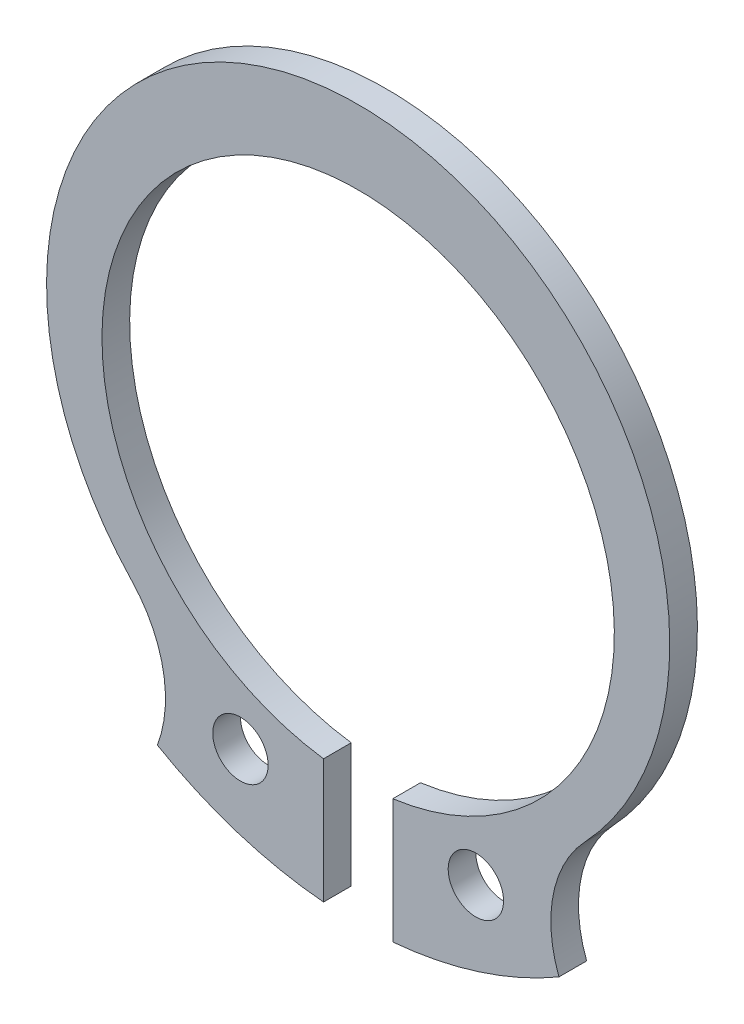
ISO-10303-21;
HEADER;
FILE_DESCRIPTION(('STEP AP214'),'2;1');
FILE_NAME('part.step','',(''),(''),'','','');
FILE_SCHEMA(('AUTOMOTIVE_DESIGN { 1 0 10303 214 1 1 1 1 }'));
ENDSEC;
DATA;
#1=APPLICATION_CONTEXT('core data for automotive mechanical design processes');
#2=APPLICATION_PROTOCOL_DEFINITION('international standard','automotive_design',2000,#1);
#3=PRODUCT_CONTEXT('',#1,'mechanical');
#4=PRODUCT('Part','Part','',(#3));
#5=PRODUCT_RELATED_PRODUCT_CATEGORY('part','',(#4));
#6=PRODUCT_DEFINITION_FORMATION('','',#4);
#7=PRODUCT_DEFINITION_CONTEXT('part definition',#1,'design');
#8=PRODUCT_DEFINITION('design','',#6,#7);
#9=PRODUCT_DEFINITION_SHAPE('','',#8);
#10=(LENGTH_UNIT() NAMED_UNIT(*) SI_UNIT(.MILLI.,.METRE.));
#11=(NAMED_UNIT(*) PLANE_ANGLE_UNIT() SI_UNIT($,.RADIAN.));
#12=(NAMED_UNIT(*) SI_UNIT($,.STERADIAN.) SOLID_ANGLE_UNIT());
#13=UNCERTAINTY_MEASURE_WITH_UNIT(LENGTH_MEASURE(1.E-05),#10,'distance_accuracy_value','');
#14=(GEOMETRIC_REPRESENTATION_CONTEXT(3) GLOBAL_UNCERTAINTY_ASSIGNED_CONTEXT((#13)) GLOBAL_UNIT_ASSIGNED_CONTEXT((#10,
#11,#12)) REPRESENTATION_CONTEXT('',''));
#15=CARTESIAN_POINT('',(0.,0.,0.));
#16=DIRECTION('',(0.,0.,1.));
#17=DIRECTION('',(1.,0.,0.));
#18=AXIS2_PLACEMENT_3D('',#15,#16,#17);
#19=CARTESIAN_POINT('',(0.,-0.67,0.5));
#20=DIRECTION('',(0.,0.,1.));
#21=DIRECTION('',(1.,0.,0.));
#22=AXIS2_PLACEMENT_3D('',#19,#20,#21);
#23=PLANE('',#22);
#24=CARTESIAN_POINT('',(-4.25,-11.0323115181894,0.5));
#25=DIRECTION('',(0.,0.,1.));
#26=DIRECTION('',(1.,0.,0.));
#27=AXIS2_PLACEMENT_3D('',#24,#25,#26);
#28=CIRCLE('',#27,1.);
#29=CARTESIAN_POINT('',(-3.25,-11.0323115181894,0.5));
#30=VERTEX_POINT('',#29);
#31=EDGE_CURVE('E150',#30,#30,#28,.T.);
#32=ORIENTED_EDGE('',*,*,#31,.F.);
#33=EDGE_LOOP('',(#32));
#34=FACE_BOUND('',#33,.T.);
#35=CARTESIAN_POINT('',(0.,-0.67,0.5));
#36=DIRECTION('',(0.,0.,-1.));
#37=DIRECTION('',(1.,0.,0.));
#38=AXIS2_PLACEMENT_3D('',#35,#36,#37);
#39=CIRCLE('',#38,9.24999999999999);
#40=CARTESIAN_POINT('',(-1.25,-9.83515138991167,0.5));
#41=VERTEX_POINT('',#40);
#42=CARTESIAN_POINT('',(1.25,-9.83515138991167,0.5));
#43=VERTEX_POINT('',#42);
#44=EDGE_CURVE('E153',#41,#43,#39,.T.);
#45=ORIENTED_EDGE('',*,*,#44,.T.);
#46=DIRECTION('',(0.,-1.,0.));
#47=VECTOR('',#46,1.);
#48=CARTESIAN_POINT('',(1.25,-9.83515138991167,0.5));
#49=LINE('',#48,#47);
#50=CARTESIAN_POINT('',(1.25,-14.3155300286088,0.5));
#51=VERTEX_POINT('',#50);
#52=EDGE_CURVE('E105',#43,#51,#49,.T.);
#53=ORIENTED_EDGE('',*,*,#52,.T.);
#54=CARTESIAN_POINT('',(0.,0.,0.5));
#55=DIRECTION('',(0.,0.,1.));
#56=DIRECTION('',(1.,0.,0.));
#57=AXIS2_PLACEMENT_3D('',#54,#55,#56);
#58=CIRCLE('',#57,14.37);
#59=CARTESIAN_POINT('',(7.25,-12.407030265136,0.5));
#60=VERTEX_POINT('',#59);
#61=EDGE_CURVE('E156',#51,#60,#58,.T.);
#62=ORIENTED_EDGE('',*,*,#61,.T.);
#63=CARTESIAN_POINT('',(11.4563475035525,-10.8080803974548,0.5));
#64=DIRECTION('',(0.,0.,-1.));
#65=DIRECTION('',(-1.,0.,0.));
#66=AXIS2_PLACEMENT_3D('',#63,#64,#65);
#67=CIRCLE('',#66,4.5);
#68=CARTESIAN_POINT('',(8.18310535968035,-7.72005742675343,0.5));
#69=VERTEX_POINT('',#68);
#70=EDGE_CURVE('E158',#60,#69,#67,.T.);
#71=ORIENTED_EDGE('',*,*,#70,.T.);
#72=CARTESIAN_POINT('',(0.,0.,0.5));
#73=DIRECTION('',(0.,0.,1.));
#74=DIRECTION('',(1.,0.,0.));
#75=AXIS2_PLACEMENT_3D('',#72,#73,#74);
#76=CIRCLE('',#75,11.25);
#77=CARTESIAN_POINT('',(-8.18310535968035,-7.72005742675343,0.5));
#78=VERTEX_POINT('',#77);
#79=EDGE_CURVE('E160',#69,#78,#76,.T.);
#80=ORIENTED_EDGE('',*,*,#79,.T.);
#81=CARTESIAN_POINT('',(-11.4563475035525,-10.8080803974548,0.5));
#82=DIRECTION('',(0.,0.,-1.));
#83=DIRECTION('',(1.,0.,0.));
#84=AXIS2_PLACEMENT_3D('',#81,#82,#83);
#85=CIRCLE('',#84,4.5);
#86=CARTESIAN_POINT('',(-7.25,-12.407030265136,0.5));
#87=VERTEX_POINT('',#86);
#88=EDGE_CURVE('E162',#78,#87,#85,.T.);
#89=ORIENTED_EDGE('',*,*,#88,.T.);
#90=CARTESIAN_POINT('',(0.,0.,0.5));
#91=DIRECTION('',(0.,0.,1.));
#92=DIRECTION('',(-1.,0.,0.));
#93=AXIS2_PLACEMENT_3D('',#90,#91,#92);
#94=CIRCLE('',#93,14.37);
#95=CARTESIAN_POINT('',(-1.25,-14.3155300286088,0.5));
#96=VERTEX_POINT('',#95);
#97=EDGE_CURVE('E57',#87,#96,#94,.T.);
#98=ORIENTED_EDGE('',*,*,#97,.T.);
#99=DIRECTION('',(0.,1.,0.));
#100=VECTOR('',#99,1.);
#101=CARTESIAN_POINT('',(-1.25,-9.83515138991167,0.5));
#102=LINE('',#101,#100);
#103=EDGE_CURVE('E52',#96,#41,#102,.T.);
#104=ORIENTED_EDGE('',*,*,#103,.T.);
#105=EDGE_LOOP('',(#45,#53,#62,#71,#80,#89,#98,#104));
#106=FACE_BOUND('',#105,.T.);
#107=CARTESIAN_POINT('',(4.25,-11.0323115181894,0.5));
#108=DIRECTION('',(0.,0.,1.));
#109=DIRECTION('',(-1.,0.,0.));
#110=AXIS2_PLACEMENT_3D('',#107,#108,#109);
#111=CIRCLE('',#110,1.);
#112=CARTESIAN_POINT('',(3.25,-11.0323115181894,0.5));
#113=VERTEX_POINT('',#112);
#114=EDGE_CURVE('E147',#113,#113,#111,.T.);
#115=ORIENTED_EDGE('',*,*,#114,.F.);
#116=EDGE_LOOP('',(#115));
#117=FACE_BOUND('',#116,.T.);
#118=ADVANCED_FACE('F37',(#34,#106,#117),#23,.T.);
#119=CARTESIAN_POINT('',(0.,-0.67,0.5));
#120=DIRECTION('',(0.,0.,-1.));
#121=DIRECTION('',(-1.,0.,0.));
#122=AXIS2_PLACEMENT_3D('',#119,#120,#121);
#123=CYLINDRICAL_SURFACE('',#122,9.24999999999999);
#124=DIRECTION('',(0.,0.,-1.));
#125=VECTOR('',#124,1.);
#126=CARTESIAN_POINT('',(-1.25,-9.83515138991167,0.5));
#127=LINE('',#126,#125);
#128=CARTESIAN_POINT('',(-1.25,-9.83515138991167,-0.5));
#129=VERTEX_POINT('',#128);
#130=EDGE_CURVE('E120',#41,#129,#127,.T.);
#131=ORIENTED_EDGE('',*,*,#130,.T.);
#132=CARTESIAN_POINT('',(0.,-0.67,-0.5));
#133=DIRECTION('',(0.,0.,-1.));
#134=DIRECTION('',(1.,0.,0.));
#135=AXIS2_PLACEMENT_3D('',#132,#133,#134);
#136=CIRCLE('',#135,9.24999999999999);
#137=CARTESIAN_POINT('',(1.25,-9.83515138991167,-0.5));
#138=VERTEX_POINT('',#137);
#139=EDGE_CURVE('E114',#129,#138,#136,.T.);
#140=ORIENTED_EDGE('',*,*,#139,.T.);
#141=DIRECTION('',(0.,0.,-1.));
#142=VECTOR('',#141,1.);
#143=CARTESIAN_POINT('',(1.25,-9.83515138991167,0.5));
#144=LINE('',#143,#142);
#145=EDGE_CURVE('E11',#43,#138,#144,.T.);
#146=ORIENTED_EDGE('',*,*,#145,.F.);
#147=ORIENTED_EDGE('',*,*,#44,.F.);
#148=EDGE_LOOP('',(#131,#140,#146,#147));
#149=FACE_BOUND('',#148,.T.);
#150=ADVANCED_FACE('F39',(#149),#123,.F.);
#151=CARTESIAN_POINT('',(1.25,-9.83515138991167,0.5));
#152=DIRECTION('',(1.,0.,0.));
#153=DIRECTION('',(0.,1.,0.));
#154=AXIS2_PLACEMENT_3D('',#151,#152,#153);
#155=PLANE('',#154);
#156=ORIENTED_EDGE('',*,*,#145,.T.);
#157=DIRECTION('',(0.,-1.,0.));
#158=VECTOR('',#157,1.);
#159=CARTESIAN_POINT('',(1.25,-9.83515138991167,-0.5));
#160=LINE('',#159,#158);
#161=CARTESIAN_POINT('',(1.25,-14.3155300286088,-0.5));
#162=VERTEX_POINT('',#161);
#163=EDGE_CURVE('E104',#138,#162,#160,.T.);
#164=ORIENTED_EDGE('',*,*,#163,.T.);
#165=DIRECTION('',(0.,0.,-1.));
#166=VECTOR('',#165,1.);
#167=CARTESIAN_POINT('',(1.25,-14.3155300286088,0.5));
#168=LINE('',#167,#166);
#169=EDGE_CURVE('E45',#51,#162,#168,.T.);
#170=ORIENTED_EDGE('',*,*,#169,.F.);
#171=ORIENTED_EDGE('',*,*,#52,.F.);
#172=EDGE_LOOP('',(#156,#164,#170,#171));
#173=FACE_BOUND('',#172,.T.);
#174=ADVANCED_FACE('F102',(#173),#155,.F.);
#175=CARTESIAN_POINT('',(0.,0.,0.5));
#176=DIRECTION('',(0.,0.,-1.));
#177=DIRECTION('',(-1.,0.,0.));
#178=AXIS2_PLACEMENT_3D('',#175,#176,#177);
#179=CYLINDRICAL_SURFACE('',#178,14.37);
#180=ORIENTED_EDGE('',*,*,#169,.T.);
#181=CARTESIAN_POINT('',(0.,0.,-0.5));
#182=DIRECTION('',(0.,0.,1.));
#183=DIRECTION('',(1.,0.,0.));
#184=AXIS2_PLACEMENT_3D('',#181,#182,#183);
#185=CIRCLE('',#184,14.37);
#186=CARTESIAN_POINT('',(7.25,-12.407030265136,-0.5));
#187=VERTEX_POINT('',#186);
#188=EDGE_CURVE('E118',#162,#187,#185,.T.);
#189=ORIENTED_EDGE('',*,*,#188,.T.);
#190=DIRECTION('',(0.,0.,-1.));
#191=VECTOR('',#190,1.);
#192=CARTESIAN_POINT('',(7.25,-12.407030265136,0.5));
#193=LINE('',#192,#191);
#194=EDGE_CURVE('E175',#60,#187,#193,.T.);
#195=ORIENTED_EDGE('',*,*,#194,.F.);
#196=ORIENTED_EDGE('',*,*,#61,.F.);
#197=EDGE_LOOP('',(#180,#189,#195,#196));
#198=FACE_BOUND('',#197,.T.);
#199=ADVANCED_FACE('F178',(#198),#179,.T.);
#200=CARTESIAN_POINT('',(11.4563475035525,-10.8080803974548,0.5));
#201=DIRECTION('',(0.,0.,-1.));
#202=DIRECTION('',(-1.,0.,0.));
#203=AXIS2_PLACEMENT_3D('',#200,#201,#202);
#204=CYLINDRICAL_SURFACE('',#203,4.5);
#205=ORIENTED_EDGE('',*,*,#194,.T.);
#206=CARTESIAN_POINT('',(11.4563475035525,-10.8080803974548,-0.5));
#207=DIRECTION('',(0.,0.,-1.));
#208=DIRECTION('',(-1.,0.,0.));
#209=AXIS2_PLACEMENT_3D('',#206,#207,#208);
#210=CIRCLE('',#209,4.5);
#211=CARTESIAN_POINT('',(8.18310535968035,-7.72005742675343,-0.5));
#212=VERTEX_POINT('',#211);
#213=EDGE_CURVE('E133',#187,#212,#210,.T.);
#214=ORIENTED_EDGE('',*,*,#213,.T.);
#215=DIRECTION('',(0.,0.,-1.));
#216=VECTOR('',#215,1.);
#217=CARTESIAN_POINT('',(8.18310535968035,-7.72005742675343,0.5));
#218=LINE('',#217,#216);
#219=EDGE_CURVE('E173',#69,#212,#218,.T.);
#220=ORIENTED_EDGE('',*,*,#219,.F.);
#221=ORIENTED_EDGE('',*,*,#70,.F.);
#222=EDGE_LOOP('',(#205,#214,#220,#221));
#223=FACE_BOUND('',#222,.T.);
#224=ADVANCED_FACE('F186',(#223),#204,.F.);
#225=CARTESIAN_POINT('',(0.,0.,0.5));
#226=DIRECTION('',(0.,0.,-1.));
#227=DIRECTION('',(-1.,0.,0.));
#228=AXIS2_PLACEMENT_3D('',#225,#226,#227);
#229=CYLINDRICAL_SURFACE('',#228,11.25);
#230=ORIENTED_EDGE('',*,*,#219,.T.);
#231=CARTESIAN_POINT('',(0.,0.,-0.5));
#232=DIRECTION('',(0.,0.,1.));
#233=DIRECTION('',(1.,0.,0.));
#234=AXIS2_PLACEMENT_3D('',#231,#232,#233);
#235=CIRCLE('',#234,11.25);
#236=CARTESIAN_POINT('',(-8.18310535968035,-7.72005742675343,-0.5));
#237=VERTEX_POINT('',#236);
#238=EDGE_CURVE('E136',#212,#237,#235,.T.);
#239=ORIENTED_EDGE('',*,*,#238,.T.);
#240=DIRECTION('',(0.,0.,-1.));
#241=VECTOR('',#240,1.);
#242=CARTESIAN_POINT('',(-8.18310535968035,-7.72005742675343,0.5));
#243=LINE('',#242,#241);
#244=EDGE_CURVE('E171',#78,#237,#243,.T.);
#245=ORIENTED_EDGE('',*,*,#244,.F.);
#246=ORIENTED_EDGE('',*,*,#79,.F.);
#247=EDGE_LOOP('',(#230,#239,#245,#246));
#248=FACE_BOUND('',#247,.T.);
#249=ADVANCED_FACE('F189',(#248),#229,.T.);
#250=CARTESIAN_POINT('',(-11.4563475035525,-10.8080803974548,0.5));
#251=DIRECTION('',(0.,0.,-1.));
#252=DIRECTION('',(-1.,0.,0.));
#253=AXIS2_PLACEMENT_3D('',#250,#251,#252);
#254=CYLINDRICAL_SURFACE('',#253,4.5);
#255=ORIENTED_EDGE('',*,*,#244,.T.);
#256=CARTESIAN_POINT('',(-11.4563475035525,-10.8080803974548,-0.5));
#257=DIRECTION('',(0.,0.,-1.));
#258=DIRECTION('',(1.,0.,0.));
#259=AXIS2_PLACEMENT_3D('',#256,#257,#258);
#260=CIRCLE('',#259,4.5);
#261=CARTESIAN_POINT('',(-7.25,-12.407030265136,-0.5));
#262=VERTEX_POINT('',#261);
#263=EDGE_CURVE('E139',#237,#262,#260,.T.);
#264=ORIENTED_EDGE('',*,*,#263,.T.);
#265=DIRECTION('',(0.,0.,-1.));
#266=VECTOR('',#265,1.);
#267=CARTESIAN_POINT('',(-7.25,-12.407030265136,0.5));
#268=LINE('',#267,#266);
#269=EDGE_CURVE('E169',#87,#262,#268,.T.);
#270=ORIENTED_EDGE('',*,*,#269,.F.);
#271=ORIENTED_EDGE('',*,*,#88,.F.);
#272=EDGE_LOOP('',(#255,#264,#270,#271));
#273=FACE_BOUND('',#272,.T.);
#274=ADVANCED_FACE('F194',(#273),#254,.F.);
#275=CARTESIAN_POINT('',(0.,0.,0.5));
#276=DIRECTION('',(0.,0.,-1.));
#277=DIRECTION('',(-1.,0.,0.));
#278=AXIS2_PLACEMENT_3D('',#275,#276,#277);
#279=CYLINDRICAL_SURFACE('',#278,14.37);
#280=ORIENTED_EDGE('',*,*,#269,.T.);
#281=CARTESIAN_POINT('',(0.,0.,-0.5));
#282=DIRECTION('',(0.,0.,1.));
#283=DIRECTION('',(-1.,0.,0.));
#284=AXIS2_PLACEMENT_3D('',#281,#282,#283);
#285=CIRCLE('',#284,14.37);
#286=CARTESIAN_POINT('',(-1.25,-14.3155300286088,-0.5));
#287=VERTEX_POINT('',#286);
#288=EDGE_CURVE('E142',#262,#287,#285,.T.);
#289=ORIENTED_EDGE('',*,*,#288,.T.);
#290=DIRECTION('',(0.,0.,-1.));
#291=VECTOR('',#290,1.);
#292=CARTESIAN_POINT('',(-1.25,-14.3155300286088,0.5));
#293=LINE('',#292,#291);
#294=EDGE_CURVE('E167',#96,#287,#293,.T.);
#295=ORIENTED_EDGE('',*,*,#294,.F.);
#296=ORIENTED_EDGE('',*,*,#97,.F.);
#297=EDGE_LOOP('',(#280,#289,#295,#296));
#298=FACE_BOUND('',#297,.T.);
#299=ADVANCED_FACE('F197',(#298),#279,.T.);
#300=CARTESIAN_POINT('',(-1.25,-9.83515138991167,0.5));
#301=DIRECTION('',(-1.,0.,0.));
#302=DIRECTION('',(0.,-1.,0.));
#303=AXIS2_PLACEMENT_3D('',#300,#301,#302);
#304=PLANE('',#303);
#305=ORIENTED_EDGE('',*,*,#294,.T.);
#306=DIRECTION('',(0.,1.,0.));
#307=VECTOR('',#306,1.);
#308=CARTESIAN_POINT('',(-1.25,-9.83515138991167,-0.5));
#309=LINE('',#308,#307);
#310=EDGE_CURVE('E145',#287,#129,#309,.T.);
#311=ORIENTED_EDGE('',*,*,#310,.T.);
#312=ORIENTED_EDGE('',*,*,#130,.F.);
#313=ORIENTED_EDGE('',*,*,#103,.F.);
#314=EDGE_LOOP('',(#305,#311,#312,#313));
#315=FACE_BOUND('',#314,.T.);
#316=ADVANCED_FACE('F199',(#315),#304,.F.);
#317=CARTESIAN_POINT('',(-4.25,-11.0323115181894,0.5));
#318=DIRECTION('',(0.,0.,-1.));
#319=DIRECTION('',(-1.,0.,0.));
#320=AXIS2_PLACEMENT_3D('',#317,#318,#319);
#321=CYLINDRICAL_SURFACE('',#320,1.);
#322=ORIENTED_EDGE('',*,*,#31,.T.);
#323=EDGE_LOOP('',(#322));
#324=FACE_BOUND('',#323,.T.);
#325=CARTESIAN_POINT('',(-4.25,-11.0323115181894,-0.5));
#326=DIRECTION('',(0.,0.,1.));
#327=DIRECTION('',(1.,0.,0.));
#328=AXIS2_PLACEMENT_3D('',#325,#326,#327);
#329=CIRCLE('',#328,1.);
#330=CARTESIAN_POINT('',(-3.25,-11.0323115181894,-0.5));
#331=VERTEX_POINT('',#330);
#332=EDGE_CURVE('E122',#331,#331,#329,.T.);
#333=ORIENTED_EDGE('',*,*,#332,.F.);
#334=EDGE_LOOP('',(#333));
#335=FACE_BOUND('',#334,.T.);
#336=ADVANCED_FACE('F201',(#324,#335),#321,.F.);
#337=CARTESIAN_POINT('',(4.25,-11.0323115181894,0.5));
#338=DIRECTION('',(0.,0.,-1.));
#339=DIRECTION('',(-1.,0.,0.));
#340=AXIS2_PLACEMENT_3D('',#337,#338,#339);
#341=CYLINDRICAL_SURFACE('',#340,1.);
#342=ORIENTED_EDGE('',*,*,#114,.T.);
#343=EDGE_LOOP('',(#342));
#344=FACE_BOUND('',#343,.T.);
#345=CARTESIAN_POINT('',(4.25,-11.0323115181894,-0.5));
#346=DIRECTION('',(0.,0.,1.));
#347=DIRECTION('',(-1.,0.,0.));
#348=AXIS2_PLACEMENT_3D('',#345,#346,#347);
#349=CIRCLE('',#348,1.);
#350=CARTESIAN_POINT('',(3.25,-11.0323115181894,-0.5));
#351=VERTEX_POINT('',#350);
#352=EDGE_CURVE('E128',#351,#351,#349,.T.);
#353=ORIENTED_EDGE('',*,*,#352,.F.);
#354=EDGE_LOOP('',(#353));
#355=FACE_BOUND('',#354,.T.);
#356=ADVANCED_FACE('F207',(#344,#355),#341,.F.);
#357=CARTESIAN_POINT('',(0.,-0.67,-0.5));
#358=DIRECTION('',(0.,0.,1.));
#359=DIRECTION('',(1.,0.,0.));
#360=AXIS2_PLACEMENT_3D('',#357,#358,#359);
#361=PLANE('',#360);
#362=ORIENTED_EDGE('',*,*,#352,.T.);
#363=EDGE_LOOP('',(#362));
#364=FACE_BOUND('',#363,.T.);
#365=ORIENTED_EDGE('',*,*,#332,.T.);
#366=EDGE_LOOP('',(#365));
#367=FACE_BOUND('',#366,.T.);
#368=ORIENTED_EDGE('',*,*,#139,.F.);
#369=ORIENTED_EDGE('',*,*,#310,.F.);
#370=ORIENTED_EDGE('',*,*,#288,.F.);
#371=ORIENTED_EDGE('',*,*,#263,.F.);
#372=ORIENTED_EDGE('',*,*,#238,.F.);
#373=ORIENTED_EDGE('',*,*,#213,.F.);
#374=ORIENTED_EDGE('',*,*,#188,.F.);
#375=ORIENTED_EDGE('',*,*,#163,.F.);
#376=EDGE_LOOP('',(#368,#369,#370,#371,#372,#373,#374,#375));
#377=FACE_BOUND('',#376,.T.);
#378=ADVANCED_FACE('F112',(#364,#367,#377),#361,.F.);
#379=CLOSED_SHELL('',(#118,#150,#174,#199,#224,#249,#274,#299,#316,#336,#356,#378));
#380=MANIFOLD_SOLID_BREP('B2',#379);
#381=ADVANCED_BREP_SHAPE_REPRESENTATION('',(#18,#380),#14);
#382=SHAPE_DEFINITION_REPRESENTATION(#9,#381);
ENDSEC;
END-ISO-10303-21;
